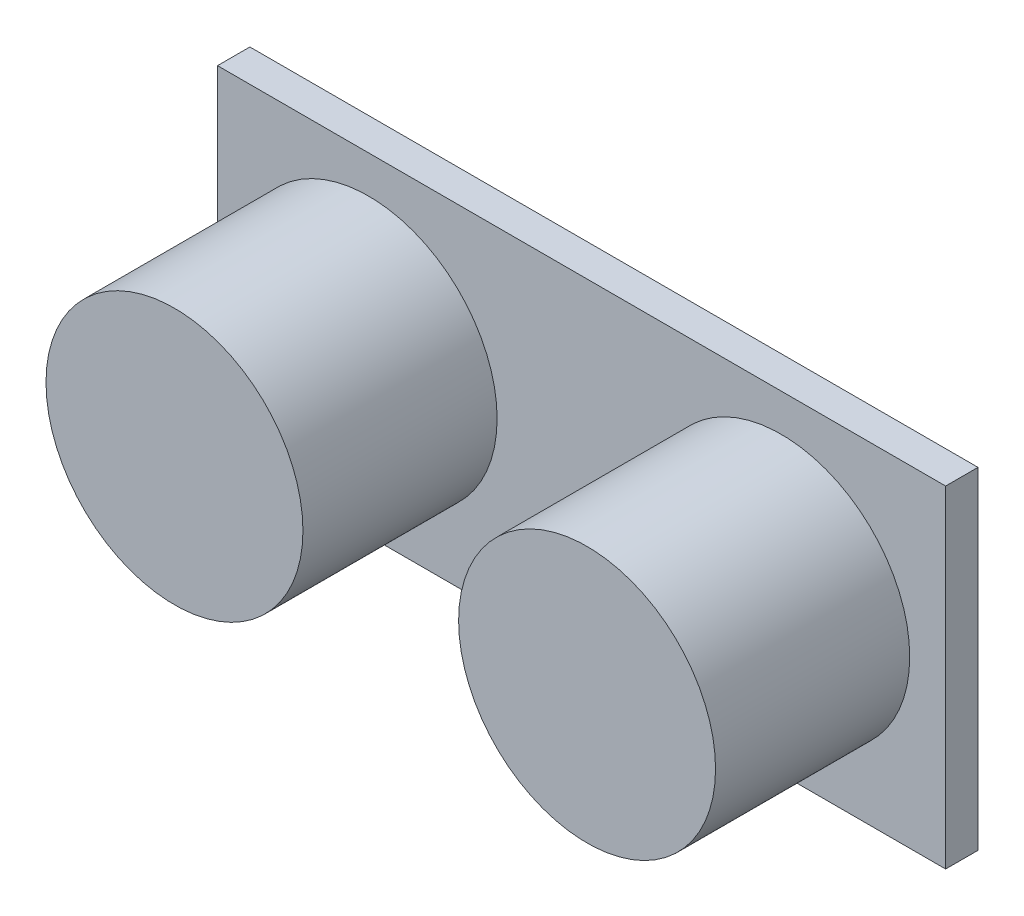
ISO-10303-21;
HEADER;
FILE_DESCRIPTION(('STEP AP214'),'2;1');
FILE_NAME('part.step','',(''),(''),'','','');
FILE_SCHEMA(('AUTOMOTIVE_DESIGN { 1 0 10303 214 1 1 1 1 }'));
ENDSEC;
DATA;
#1=APPLICATION_CONTEXT('core data for automotive mechanical design processes');
#2=APPLICATION_PROTOCOL_DEFINITION('international standard','automotive_design',2000,#1);
#3=PRODUCT_CONTEXT('',#1,'mechanical');
#4=PRODUCT('Part','Part','',(#3));
#5=PRODUCT_RELATED_PRODUCT_CATEGORY('part','',(#4));
#6=PRODUCT_DEFINITION_FORMATION('','',#4);
#7=PRODUCT_DEFINITION_CONTEXT('part definition',#1,'design');
#8=PRODUCT_DEFINITION('design','',#6,#7);
#9=PRODUCT_DEFINITION_SHAPE('','',#8);
#10=(LENGTH_UNIT() NAMED_UNIT(*) SI_UNIT(.MILLI.,.METRE.));
#11=(NAMED_UNIT(*) PLANE_ANGLE_UNIT() SI_UNIT($,.RADIAN.));
#12=(NAMED_UNIT(*) SI_UNIT($,.STERADIAN.) SOLID_ANGLE_UNIT());
#13=UNCERTAINTY_MEASURE_WITH_UNIT(LENGTH_MEASURE(1.E-05),#10,'distance_accuracy_value','');
#14=(GEOMETRIC_REPRESENTATION_CONTEXT(3) GLOBAL_UNCERTAINTY_ASSIGNED_CONTEXT((#13)) GLOBAL_UNIT_ASSIGNED_CONTEXT((#10,
#11,#12)) REPRESENTATION_CONTEXT('',''));
#15=CARTESIAN_POINT('',(0.,0.,0.));
#16=DIRECTION('',(0.,0.,1.));
#17=DIRECTION('',(1.,0.,0.));
#18=AXIS2_PLACEMENT_3D('',#15,#16,#17);
#19=CARTESIAN_POINT('',(22.5,10.25,2.));
#20=DIRECTION('',(-1.,0.,0.));
#21=DIRECTION('',(0.,-1.,0.));
#22=AXIS2_PLACEMENT_3D('',#19,#20,#21);
#23=PLANE('',#22);
#24=DIRECTION('',(0.,1.,0.));
#25=VECTOR('',#24,1.);
#26=CARTESIAN_POINT('',(22.5,10.25,0.));
#27=LINE('',#26,#25);
#28=CARTESIAN_POINT('',(22.5,-10.25,0.));
#29=VERTEX_POINT('',#28);
#30=CARTESIAN_POINT('',(22.5,10.25,0.));
#31=VERTEX_POINT('',#30);
#32=EDGE_CURVE('E113',#29,#31,#27,.T.);
#33=ORIENTED_EDGE('',*,*,#32,.T.);
#34=DIRECTION('',(0.,0.,-1.));
#35=VECTOR('',#34,1.);
#36=CARTESIAN_POINT('',(22.5,10.25,2.));
#37=LINE('',#36,#35);
#38=CARTESIAN_POINT('',(22.5,10.25,2.));
#39=VERTEX_POINT('',#38);
#40=EDGE_CURVE('E11',#39,#31,#37,.T.);
#41=ORIENTED_EDGE('',*,*,#40,.F.);
#42=DIRECTION('',(0.,1.,0.));
#43=VECTOR('',#42,1.);
#44=CARTESIAN_POINT('',(22.5,10.25,2.));
#45=LINE('',#44,#43);
#46=CARTESIAN_POINT('',(22.5,-10.25,2.));
#47=VERTEX_POINT('',#46);
#48=EDGE_CURVE('E97',#47,#39,#45,.T.);
#49=ORIENTED_EDGE('',*,*,#48,.F.);
#50=DIRECTION('',(0.,0.,-1.));
#51=VECTOR('',#50,1.);
#52=CARTESIAN_POINT('',(22.5,-10.25,2.));
#53=LINE('',#52,#51);
#54=EDGE_CURVE('E109',#47,#29,#53,.T.);
#55=ORIENTED_EDGE('',*,*,#54,.T.);
#56=EDGE_LOOP('',(#33,#41,#49,#55));
#57=FACE_BOUND('',#56,.T.);
#58=ADVANCED_FACE('F45',(#57),#23,.F.);
#59=CARTESIAN_POINT('',(-22.5,10.25,2.));
#60=DIRECTION('',(0.,-1.,0.));
#61=DIRECTION('',(0.,0.,-1.));
#62=AXIS2_PLACEMENT_3D('',#59,#60,#61);
#63=PLANE('',#62);
#64=DIRECTION('',(-1.,0.,0.));
#65=VECTOR('',#64,1.);
#66=CARTESIAN_POINT('',(-22.5,10.25,0.));
#67=LINE('',#66,#65);
#68=CARTESIAN_POINT('',(-22.5,10.25,0.));
#69=VERTEX_POINT('',#68);
#70=EDGE_CURVE('E102',#31,#69,#67,.T.);
#71=ORIENTED_EDGE('',*,*,#70,.T.);
#72=DIRECTION('',(0.,0.,-1.));
#73=VECTOR('',#72,1.);
#74=CARTESIAN_POINT('',(-22.5,10.25,2.));
#75=LINE('',#74,#73);
#76=CARTESIAN_POINT('',(-22.5,10.25,2.));
#77=VERTEX_POINT('',#76);
#78=EDGE_CURVE('E54',#77,#69,#75,.T.);
#79=ORIENTED_EDGE('',*,*,#78,.F.);
#80=DIRECTION('',(-1.,0.,0.));
#81=VECTOR('',#80,1.);
#82=CARTESIAN_POINT('',(-22.5,10.25,2.));
#83=LINE('',#82,#81);
#84=EDGE_CURVE('E92',#39,#77,#83,.T.);
#85=ORIENTED_EDGE('',*,*,#84,.F.);
#86=ORIENTED_EDGE('',*,*,#40,.T.);
#87=EDGE_LOOP('',(#71,#79,#85,#86));
#88=FACE_BOUND('',#87,.T.);
#89=ADVANCED_FACE('F101',(#88),#63,.F.);
#90=CARTESIAN_POINT('',(-22.5,10.25,2.));
#91=DIRECTION('',(1.,0.,0.));
#92=DIRECTION('',(0.,1.,0.));
#93=AXIS2_PLACEMENT_3D('',#90,#91,#92);
#94=PLANE('',#93);
#95=DIRECTION('',(0.,-1.,0.));
#96=VECTOR('',#95,1.);
#97=CARTESIAN_POINT('',(-22.5,10.25,0.));
#98=LINE('',#97,#96);
#99=CARTESIAN_POINT('',(-22.5,-10.25,0.));
#100=VERTEX_POINT('',#99);
#101=EDGE_CURVE('E79',#69,#100,#98,.T.);
#102=ORIENTED_EDGE('',*,*,#101,.T.);
#103=DIRECTION('',(0.,0.,-1.));
#104=VECTOR('',#103,1.);
#105=CARTESIAN_POINT('',(-22.5,-10.25,2.));
#106=LINE('',#105,#104);
#107=CARTESIAN_POINT('',(-22.5,-10.25,2.));
#108=VERTEX_POINT('',#107);
#109=EDGE_CURVE('E104',#108,#100,#106,.T.);
#110=ORIENTED_EDGE('',*,*,#109,.F.);
#111=DIRECTION('',(0.,-1.,0.));
#112=VECTOR('',#111,1.);
#113=CARTESIAN_POINT('',(-22.5,10.25,2.));
#114=LINE('',#113,#112);
#115=EDGE_CURVE('E95',#77,#108,#114,.T.);
#116=ORIENTED_EDGE('',*,*,#115,.F.);
#117=ORIENTED_EDGE('',*,*,#78,.T.);
#118=EDGE_LOOP('',(#102,#110,#116,#117));
#119=FACE_BOUND('',#118,.T.);
#120=ADVANCED_FACE('F105',(#119),#94,.F.);
#121=CARTESIAN_POINT('',(-22.5,-10.25,2.));
#122=DIRECTION('',(0.,1.,0.));
#123=DIRECTION('',(0.,0.,1.));
#124=AXIS2_PLACEMENT_3D('',#121,#122,#123);
#125=PLANE('',#124);
#126=DIRECTION('',(1.,0.,0.));
#127=VECTOR('',#126,1.);
#128=CARTESIAN_POINT('',(-22.5,-10.25,0.));
#129=LINE('',#128,#127);
#130=EDGE_CURVE('E85',#100,#29,#129,.T.);
#131=ORIENTED_EDGE('',*,*,#130,.T.);
#132=ORIENTED_EDGE('',*,*,#54,.F.);
#133=DIRECTION('',(1.,0.,0.));
#134=VECTOR('',#133,1.);
#135=CARTESIAN_POINT('',(-22.5,-10.25,2.));
#136=LINE('',#135,#134);
#137=EDGE_CURVE('E62',#108,#47,#136,.T.);
#138=ORIENTED_EDGE('',*,*,#137,.F.);
#139=ORIENTED_EDGE('',*,*,#109,.T.);
#140=EDGE_LOOP('',(#131,#132,#138,#139));
#141=FACE_BOUND('',#140,.T.);
#142=ADVANCED_FACE('F127',(#141),#125,.F.);
#143=CARTESIAN_POINT('',(0.,0.,2.));
#144=DIRECTION('',(0.,0.,1.));
#145=DIRECTION('',(1.,0.,0.));
#146=AXIS2_PLACEMENT_3D('',#143,#144,#145);
#147=PLANE('',#146);
#148=CARTESIAN_POINT('',(12.34,0.,2.));
#149=DIRECTION('',(0.,0.,1.));
#150=DIRECTION('',(1.,0.,0.));
#151=AXIS2_PLACEMENT_3D('',#148,#149,#150);
#152=CIRCLE('',#151,7.94);
#153=CARTESIAN_POINT('',(20.28,0.,2.));
#154=VERTEX_POINT('',#153);
#155=EDGE_CURVE('E142',#154,#154,#152,.T.);
#156=ORIENTED_EDGE('',*,*,#155,.F.);
#157=EDGE_LOOP('',(#156));
#158=FACE_BOUND('',#157,.T.);
#159=CARTESIAN_POINT('',(-13.16,0.,2.));
#160=DIRECTION('',(0.,0.,1.));
#161=DIRECTION('',(1.,0.,0.));
#162=AXIS2_PLACEMENT_3D('',#159,#160,#161);
#163=CIRCLE('',#162,7.94);
#164=CARTESIAN_POINT('',(-5.21999999999999,0.,2.));
#165=VERTEX_POINT('',#164);
#166=EDGE_CURVE('E134',#165,#165,#163,.T.);
#167=ORIENTED_EDGE('',*,*,#166,.F.);
#168=EDGE_LOOP('',(#167));
#169=FACE_BOUND('',#168,.T.);
#170=ORIENTED_EDGE('',*,*,#48,.T.);
#171=ORIENTED_EDGE('',*,*,#84,.T.);
#172=ORIENTED_EDGE('',*,*,#115,.T.);
#173=ORIENTED_EDGE('',*,*,#137,.T.);
#174=EDGE_LOOP('',(#170,#171,#172,#173));
#175=FACE_BOUND('',#174,.T.);
#176=ADVANCED_FACE('F93',(#158,#169,#175),#147,.T.);
#177=CARTESIAN_POINT('',(0.,0.,0.));
#178=DIRECTION('',(0.,0.,1.));
#179=DIRECTION('',(1.,0.,0.));
#180=AXIS2_PLACEMENT_3D('',#177,#178,#179);
#181=PLANE('',#180);
#182=ORIENTED_EDGE('',*,*,#32,.F.);
#183=ORIENTED_EDGE('',*,*,#130,.F.);
#184=ORIENTED_EDGE('',*,*,#101,.F.);
#185=ORIENTED_EDGE('',*,*,#70,.F.);
#186=EDGE_LOOP('',(#182,#183,#184,#185));
#187=FACE_BOUND('',#186,.T.);
#188=ADVANCED_FACE('F130',(#187),#181,.F.);
#189=CARTESIAN_POINT('',(-13.16,0.,14.));
#190=DIRECTION('',(0.,0.,-1.));
#191=DIRECTION('',(-1.,0.,0.));
#192=AXIS2_PLACEMENT_3D('',#189,#190,#191);
#193=CYLINDRICAL_SURFACE('',#192,7.94);
#194=CARTESIAN_POINT('',(-13.16,0.,14.));
#195=DIRECTION('',(0.,0.,1.));
#196=DIRECTION('',(1.,0.,0.));
#197=AXIS2_PLACEMENT_3D('',#194,#195,#196);
#198=CIRCLE('',#197,7.94);
#199=CARTESIAN_POINT('',(-5.21999999999999,0.,14.));
#200=VERTEX_POINT('',#199);
#201=EDGE_CURVE('E117',#200,#200,#198,.T.);
#202=ORIENTED_EDGE('',*,*,#201,.F.);
#203=EDGE_LOOP('',(#202));
#204=FACE_BOUND('',#203,.T.);
#205=ORIENTED_EDGE('',*,*,#166,.T.);
#206=EDGE_LOOP('',(#205));
#207=FACE_BOUND('',#206,.T.);
#208=ADVANCED_FACE('F164',(#204,#207),#193,.T.);
#209=CARTESIAN_POINT('',(-13.16,0.,14.));
#210=DIRECTION('',(0.,0.,1.));
#211=DIRECTION('',(1.,0.,0.));
#212=AXIS2_PLACEMENT_3D('',#209,#210,#211);
#213=PLANE('',#212);
#214=ORIENTED_EDGE('',*,*,#201,.T.);
#215=EDGE_LOOP('',(#214));
#216=FACE_BOUND('',#215,.T.);
#217=ADVANCED_FACE('F155',(#216),#213,.T.);
#218=CARTESIAN_POINT('',(12.34,0.,14.));
#219=DIRECTION('',(0.,0.,-1.));
#220=DIRECTION('',(-1.,0.,0.));
#221=AXIS2_PLACEMENT_3D('',#218,#219,#220);
#222=CYLINDRICAL_SURFACE('',#221,7.94);
#223=CARTESIAN_POINT('',(12.34,0.,14.));
#224=DIRECTION('',(0.,0.,1.));
#225=DIRECTION('',(1.,0.,0.));
#226=AXIS2_PLACEMENT_3D('',#223,#224,#225);
#227=CIRCLE('',#226,7.94);
#228=CARTESIAN_POINT('',(20.28,0.,14.));
#229=VERTEX_POINT('',#228);
#230=EDGE_CURVE('E138',#229,#229,#227,.T.);
#231=ORIENTED_EDGE('',*,*,#230,.F.);
#232=EDGE_LOOP('',(#231));
#233=FACE_BOUND('',#232,.T.);
#234=ORIENTED_EDGE('',*,*,#155,.T.);
#235=EDGE_LOOP('',(#234));
#236=FACE_BOUND('',#235,.T.);
#237=ADVANCED_FACE('F152',(#233,#236),#222,.T.);
#238=CARTESIAN_POINT('',(12.34,0.,14.));
#239=DIRECTION('',(0.,0.,1.));
#240=DIRECTION('',(1.,0.,0.));
#241=AXIS2_PLACEMENT_3D('',#238,#239,#240);
#242=PLANE('',#241);
#243=ORIENTED_EDGE('',*,*,#230,.T.);
#244=EDGE_LOOP('',(#243));
#245=FACE_BOUND('',#244,.T.);
#246=ADVANCED_FACE('F150',(#245),#242,.T.);
#247=CLOSED_SHELL('',(#58,#89,#120,#142,#176,#188,#208,#217,#237,#246));
#248=MANIFOLD_SOLID_BREP('B2',#247);
#249=ADVANCED_BREP_SHAPE_REPRESENTATION('',(#18,#248),#14);
#250=SHAPE_DEFINITION_REPRESENTATION(#9,#249);
ENDSEC;
END-ISO-10303-21;
